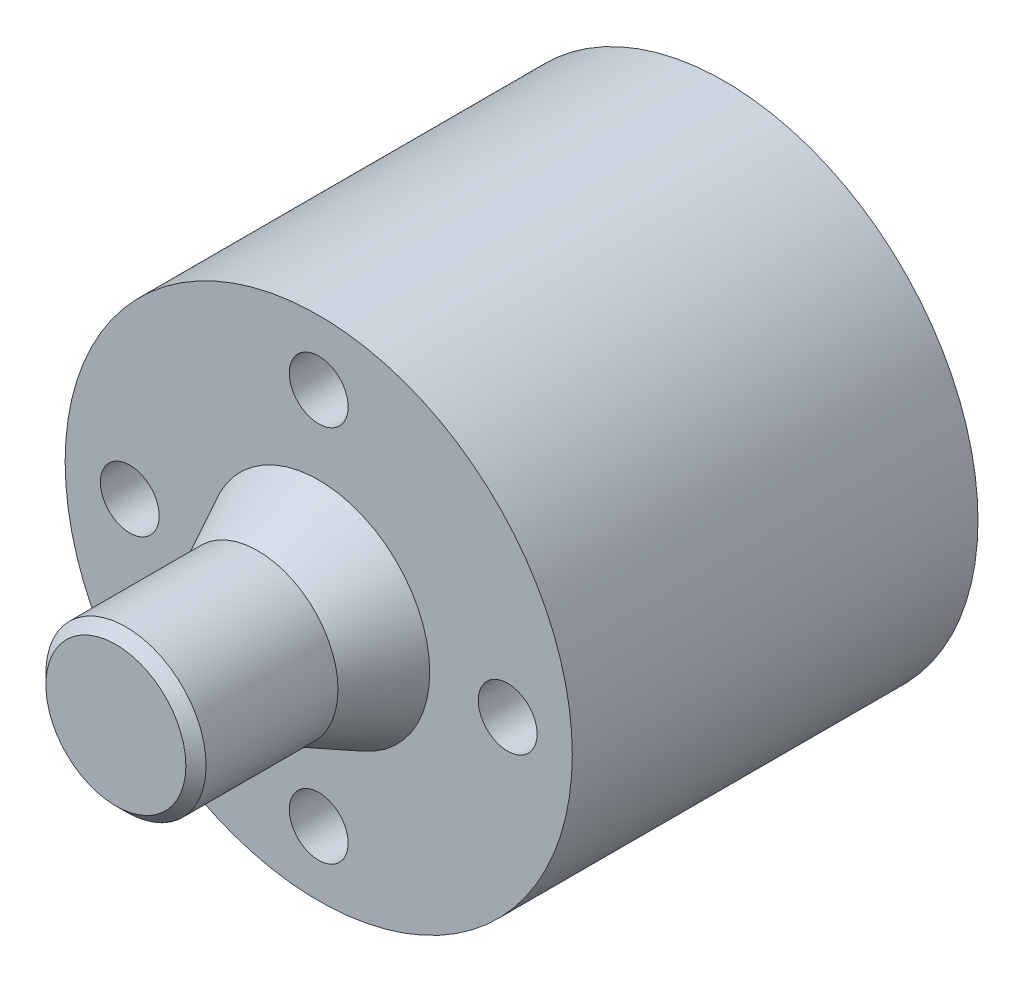
ISO-10303-21;
HEADER;
FILE_DESCRIPTION(('STEP AP214'),'2;1');
FILE_NAME('part.step','',(''),(''),'','','');
FILE_SCHEMA(('AUTOMOTIVE_DESIGN { 1 0 10303 214 1 1 1 1 }'));
ENDSEC;
DATA;
#1=APPLICATION_CONTEXT('core data for automotive mechanical design processes');
#2=APPLICATION_PROTOCOL_DEFINITION('international standard','automotive_design',2000,#1);
#3=PRODUCT_CONTEXT('',#1,'mechanical');
#4=PRODUCT('Part','Part','',(#3));
#5=PRODUCT_RELATED_PRODUCT_CATEGORY('part','',(#4));
#6=PRODUCT_DEFINITION_FORMATION('','',#4);
#7=PRODUCT_DEFINITION_CONTEXT('part definition',#1,'design');
#8=PRODUCT_DEFINITION('design','',#6,#7);
#9=PRODUCT_DEFINITION_SHAPE('','',#8);
#10=(LENGTH_UNIT() NAMED_UNIT(*) SI_UNIT(.MILLI.,.METRE.));
#11=(NAMED_UNIT(*) PLANE_ANGLE_UNIT() SI_UNIT($,.RADIAN.));
#12=(NAMED_UNIT(*) SI_UNIT($,.STERADIAN.) SOLID_ANGLE_UNIT());
#13=UNCERTAINTY_MEASURE_WITH_UNIT(LENGTH_MEASURE(1.E-05),#10,'distance_accuracy_value','');
#14=(GEOMETRIC_REPRESENTATION_CONTEXT(3) GLOBAL_UNCERTAINTY_ASSIGNED_CONTEXT((#13)) GLOBAL_UNIT_ASSIGNED_CONTEXT((#10,
#11,#12)) REPRESENTATION_CONTEXT('',''));
#15=CARTESIAN_POINT('',(0.,0.,0.));
#16=DIRECTION('',(0.,0.,1.));
#17=DIRECTION('',(1.,0.,0.));
#18=AXIS2_PLACEMENT_3D('',#15,#16,#17);
#19=CARTESIAN_POINT('',(0.,0.,7.5));
#20=DIRECTION('',(0.,0.,-1.));
#21=DIRECTION('',(-1.,0.,0.));
#22=AXIS2_PLACEMENT_3D('',#19,#20,#21);
#23=CYLINDRICAL_SURFACE('',#22,12.5);
#24=CARTESIAN_POINT('',(0.,0.,-7.5));
#25=DIRECTION('',(0.,0.,1.));
#26=DIRECTION('',(1.,0.,0.));
#27=AXIS2_PLACEMENT_3D('',#24,#25,#26);
#28=CIRCLE('',#27,12.5);
#29=CARTESIAN_POINT('',(12.5,0.,-7.5));
#30=VERTEX_POINT('',#29);
#31=EDGE_CURVE('E105',#30,#30,#28,.T.);
#32=ORIENTED_EDGE('',*,*,#31,.T.);
#33=EDGE_LOOP('',(#32));
#34=FACE_BOUND('',#33,.T.);
#35=CARTESIAN_POINT('',(0.,0.,12.5));
#36=DIRECTION('',(0.,0.,1.));
#37=DIRECTION('',(1.,0.,0.));
#38=AXIS2_PLACEMENT_3D('',#35,#36,#37);
#39=CIRCLE('',#38,12.5);
#40=CARTESIAN_POINT('',(12.5,0.,12.5));
#41=VERTEX_POINT('',#40);
#42=EDGE_CURVE('E110',#41,#41,#39,.T.);
#43=ORIENTED_EDGE('',*,*,#42,.F.);
#44=EDGE_LOOP('',(#43));
#45=FACE_BOUND('',#44,.T.);
#46=ADVANCED_FACE('F34',(#34,#45),#23,.T.);
#47=CARTESIAN_POINT('',(0.,0.,-7.5));
#48=DIRECTION('',(0.,0.,1.));
#49=DIRECTION('',(1.,0.,0.));
#50=AXIS2_PLACEMENT_3D('',#47,#48,#49);
#51=PLANE('',#50);
#52=CARTESIAN_POINT('',(9.315,0.,-7.5));
#53=DIRECTION('',(0.,0.,1.));
#54=DIRECTION('',(1.,0.,0.));
#55=AXIS2_PLACEMENT_3D('',#52,#53,#54);
#56=CIRCLE('',#55,1.45);
#57=CARTESIAN_POINT('',(10.765,0.,-7.5));
#58=VERTEX_POINT('',#57);
#59=EDGE_CURVE('E191',#58,#58,#56,.T.);
#60=ORIENTED_EDGE('',*,*,#59,.T.);
#61=EDGE_LOOP('',(#60));
#62=FACE_BOUND('',#61,.T.);
#63=CARTESIAN_POINT('',(0.,-9.315,-7.5));
#64=DIRECTION('',(0.,0.,1.));
#65=DIRECTION('',(1.,0.,0.));
#66=AXIS2_PLACEMENT_3D('',#63,#64,#65);
#67=CIRCLE('',#66,1.45);
#68=CARTESIAN_POINT('',(1.44999999999997,-9.315,-7.5));
#69=VERTEX_POINT('',#68);
#70=EDGE_CURVE('E194',#69,#69,#67,.T.);
#71=ORIENTED_EDGE('',*,*,#70,.T.);
#72=EDGE_LOOP('',(#71));
#73=FACE_BOUND('',#72,.T.);
#74=CARTESIAN_POINT('',(-9.315,0.,-7.5));
#75=DIRECTION('',(0.,0.,1.));
#76=DIRECTION('',(1.,0.,0.));
#77=AXIS2_PLACEMENT_3D('',#74,#75,#76);
#78=CIRCLE('',#77,1.45);
#79=CARTESIAN_POINT('',(-7.865,0.,-7.5));
#80=VERTEX_POINT('',#79);
#81=EDGE_CURVE('E197',#80,#80,#78,.T.);
#82=ORIENTED_EDGE('',*,*,#81,.T.);
#83=EDGE_LOOP('',(#82));
#84=FACE_BOUND('',#83,.T.);
#85=CARTESIAN_POINT('',(0.,9.315,-7.5));
#86=DIRECTION('',(0.,0.,1.));
#87=DIRECTION('',(1.,0.,0.));
#88=AXIS2_PLACEMENT_3D('',#85,#86,#87);
#89=CIRCLE('',#88,1.45);
#90=CARTESIAN_POINT('',(1.4500000000001,9.315,-7.5));
#91=VERTEX_POINT('',#90);
#92=EDGE_CURVE('E190',#91,#91,#89,.T.);
#93=ORIENTED_EDGE('',*,*,#92,.T.);
#94=EDGE_LOOP('',(#93));
#95=FACE_BOUND('',#94,.T.);
#96=DIRECTION('',(-1.,0.,0.));
#97=VECTOR('',#96,1.);
#98=CARTESIAN_POINT('',(-6.125,-6.125,-7.5));
#99=LINE('',#98,#97);
#100=CARTESIAN_POINT('',(6.125,-6.125,-7.5));
#101=VERTEX_POINT('',#100);
#102=CARTESIAN_POINT('',(-6.125,-6.125,-7.5));
#103=VERTEX_POINT('',#102);
#104=EDGE_CURVE('E203',#101,#103,#99,.T.);
#105=ORIENTED_EDGE('',*,*,#104,.F.);
#106=DIRECTION('',(0.,-1.,0.));
#107=VECTOR('',#106,1.);
#108=CARTESIAN_POINT('',(6.125,6.125,-7.5));
#109=LINE('',#108,#107);
#110=CARTESIAN_POINT('',(6.125,6.125,-7.5));
#111=VERTEX_POINT('',#110);
#112=EDGE_CURVE('E90',#111,#101,#109,.T.);
#113=ORIENTED_EDGE('',*,*,#112,.F.);
#114=DIRECTION('',(1.,0.,0.));
#115=VECTOR('',#114,1.);
#116=CARTESIAN_POINT('',(-6.125,6.125,-7.5));
#117=LINE('',#116,#115);
#118=CARTESIAN_POINT('',(-6.125,6.125,-7.5));
#119=VERTEX_POINT('',#118);
#120=EDGE_CURVE('E94',#119,#111,#117,.T.);
#121=ORIENTED_EDGE('',*,*,#120,.F.);
#122=DIRECTION('',(0.,1.,0.));
#123=VECTOR('',#122,1.);
#124=CARTESIAN_POINT('',(-6.125,6.125,-7.5));
#125=LINE('',#124,#123);
#126=EDGE_CURVE('E49',#103,#119,#125,.T.);
#127=ORIENTED_EDGE('',*,*,#126,.F.);
#128=EDGE_LOOP('',(#105,#113,#121,#127));
#129=FACE_BOUND('',#128,.T.);
#130=ORIENTED_EDGE('',*,*,#31,.F.);
#131=EDGE_LOOP('',(#130));
#132=FACE_BOUND('',#131,.T.);
#133=ADVANCED_FACE('F126',(#62,#73,#84,#95,#129,#132),#51,.F.);
#134=CARTESIAN_POINT('',(6.125,6.125,-7.501));
#135=DIRECTION('',(1.,0.,0.));
#136=DIRECTION('',(0.,1.,0.));
#137=AXIS2_PLACEMENT_3D('',#134,#135,#136);
#138=PLANE('',#137);
#139=ORIENTED_EDGE('',*,*,#112,.T.);
#140=DIRECTION('',(0.,0.,1.));
#141=VECTOR('',#140,1.);
#142=CARTESIAN_POINT('',(6.125,-6.125,-7.501));
#143=LINE('',#142,#141);
#144=CARTESIAN_POINT('',(6.125,-6.125,7.5));
#145=VERTEX_POINT('',#144);
#146=EDGE_CURVE('E57',#101,#145,#143,.T.);
#147=ORIENTED_EDGE('',*,*,#146,.T.);
#148=DIRECTION('',(0.,1.,0.));
#149=VECTOR('',#148,1.);
#150=CARTESIAN_POINT('',(6.125,6.125,7.5));
#151=LINE('',#150,#149);
#152=CARTESIAN_POINT('',(6.125,6.125,7.5));
#153=VERTEX_POINT('',#152);
#154=EDGE_CURVE('E80',#145,#153,#151,.T.);
#155=ORIENTED_EDGE('',*,*,#154,.T.);
#156=DIRECTION('',(0.,0.,1.));
#157=VECTOR('',#156,1.);
#158=CARTESIAN_POINT('',(6.125,6.125,-7.501));
#159=LINE('',#158,#157);
#160=EDGE_CURVE('E88',#111,#153,#159,.T.);
#161=ORIENTED_EDGE('',*,*,#160,.F.);
#162=EDGE_LOOP('',(#139,#147,#155,#161));
#163=FACE_BOUND('',#162,.T.);
#164=ADVANCED_FACE('F87',(#163),#138,.F.);
#165=CARTESIAN_POINT('',(-6.125,-6.125,-7.501));
#166=DIRECTION('',(0.,-1.,0.));
#167=DIRECTION('',(0.,0.,-1.));
#168=AXIS2_PLACEMENT_3D('',#165,#166,#167);
#169=PLANE('',#168);
#170=ORIENTED_EDGE('',*,*,#104,.T.);
#171=DIRECTION('',(0.,0.,1.));
#172=VECTOR('',#171,1.);
#173=CARTESIAN_POINT('',(-6.125,-6.125,-7.501));
#174=LINE('',#173,#172);
#175=CARTESIAN_POINT('',(-6.125,-6.125,7.5));
#176=VERTEX_POINT('',#175);
#177=EDGE_CURVE('E99',#103,#176,#174,.T.);
#178=ORIENTED_EDGE('',*,*,#177,.T.);
#179=DIRECTION('',(1.,0.,0.));
#180=VECTOR('',#179,1.);
#181=CARTESIAN_POINT('',(-6.125,-6.125,7.5));
#182=LINE('',#181,#180);
#183=EDGE_CURVE('E97',#176,#145,#182,.T.);
#184=ORIENTED_EDGE('',*,*,#183,.T.);
#185=ORIENTED_EDGE('',*,*,#146,.F.);
#186=EDGE_LOOP('',(#170,#178,#184,#185));
#187=FACE_BOUND('',#186,.T.);
#188=ADVANCED_FACE('F137',(#187),#169,.F.);
#189=CARTESIAN_POINT('',(-6.125,6.125,-7.501));
#190=DIRECTION('',(-1.,0.,0.));
#191=DIRECTION('',(0.,-1.,0.));
#192=AXIS2_PLACEMENT_3D('',#189,#190,#191);
#193=PLANE('',#192);
#194=ORIENTED_EDGE('',*,*,#126,.T.);
#195=DIRECTION('',(0.,0.,1.));
#196=VECTOR('',#195,1.);
#197=CARTESIAN_POINT('',(-6.125,6.125,-7.501));
#198=LINE('',#197,#196);
#199=CARTESIAN_POINT('',(-6.125,6.125,7.5));
#200=VERTEX_POINT('',#199);
#201=EDGE_CURVE('E96',#119,#200,#198,.T.);
#202=ORIENTED_EDGE('',*,*,#201,.T.);
#203=DIRECTION('',(0.,-1.,0.));
#204=VECTOR('',#203,1.);
#205=CARTESIAN_POINT('',(-6.125,6.125,7.5));
#206=LINE('',#205,#204);
#207=EDGE_CURVE('E82',#200,#176,#206,.T.);
#208=ORIENTED_EDGE('',*,*,#207,.T.);
#209=ORIENTED_EDGE('',*,*,#177,.F.);
#210=EDGE_LOOP('',(#194,#202,#208,#209));
#211=FACE_BOUND('',#210,.T.);
#212=ADVANCED_FACE('F141',(#211),#193,.F.);
#213=CARTESIAN_POINT('',(-6.125,6.125,-7.501));
#214=DIRECTION('',(0.,1.,0.));
#215=DIRECTION('',(0.,0.,1.));
#216=AXIS2_PLACEMENT_3D('',#213,#214,#215);
#217=PLANE('',#216);
#218=ORIENTED_EDGE('',*,*,#120,.T.);
#219=ORIENTED_EDGE('',*,*,#160,.T.);
#220=DIRECTION('',(-1.,0.,0.));
#221=VECTOR('',#220,1.);
#222=CARTESIAN_POINT('',(-6.125,6.125,7.5));
#223=LINE('',#222,#221);
#224=EDGE_CURVE('E77',#153,#200,#223,.T.);
#225=ORIENTED_EDGE('',*,*,#224,.T.);
#226=ORIENTED_EDGE('',*,*,#201,.F.);
#227=EDGE_LOOP('',(#218,#219,#225,#226));
#228=FACE_BOUND('',#227,.T.);
#229=ADVANCED_FACE('F92',(#228),#217,.F.);
#230=CARTESIAN_POINT('',(0.,9.315,-7.5));
#231=DIRECTION('',(0.,0.,1.));
#232=DIRECTION('',(1.,0.,0.));
#233=AXIS2_PLACEMENT_3D('',#230,#231,#232);
#234=CYLINDRICAL_SURFACE('',#233,1.45);
#235=ORIENTED_EDGE('',*,*,#92,.F.);
#236=EDGE_LOOP('',(#235));
#237=FACE_BOUND('',#236,.T.);
#238=CARTESIAN_POINT('',(0.,9.315,12.5));
#239=DIRECTION('',(0.,0.,1.));
#240=DIRECTION('',(1.,0.,0.));
#241=AXIS2_PLACEMENT_3D('',#238,#239,#240);
#242=CIRCLE('',#241,1.45);
#243=CARTESIAN_POINT('',(1.4500000000001,9.315,12.5));
#244=VERTEX_POINT('',#243);
#245=EDGE_CURVE('E186',#244,#244,#242,.T.);
#246=ORIENTED_EDGE('',*,*,#245,.T.);
#247=EDGE_LOOP('',(#246));
#248=FACE_BOUND('',#247,.T.);
#249=ADVANCED_FACE('F140',(#237,#248),#234,.F.);
#250=CARTESIAN_POINT('',(-9.315,0.,-7.5));
#251=DIRECTION('',(0.,0.,1.));
#252=DIRECTION('',(1.,0.,0.));
#253=AXIS2_PLACEMENT_3D('',#250,#251,#252);
#254=CYLINDRICAL_SURFACE('',#253,1.45);
#255=ORIENTED_EDGE('',*,*,#81,.F.);
#256=EDGE_LOOP('',(#255));
#257=FACE_BOUND('',#256,.T.);
#258=CARTESIAN_POINT('',(-9.315,0.,12.5));
#259=DIRECTION('',(0.,0.,1.));
#260=DIRECTION('',(1.,0.,0.));
#261=AXIS2_PLACEMENT_3D('',#258,#259,#260);
#262=CIRCLE('',#261,1.45);
#263=CARTESIAN_POINT('',(-7.865,0.,12.5));
#264=VERTEX_POINT('',#263);
#265=EDGE_CURVE('E179',#264,#264,#262,.T.);
#266=ORIENTED_EDGE('',*,*,#265,.T.);
#267=EDGE_LOOP('',(#266));
#268=FACE_BOUND('',#267,.T.);
#269=ADVANCED_FACE('F148',(#257,#268),#254,.F.);
#270=CARTESIAN_POINT('',(0.,-9.315,-7.5));
#271=DIRECTION('',(0.,0.,1.));
#272=DIRECTION('',(1.,0.,0.));
#273=AXIS2_PLACEMENT_3D('',#270,#271,#272);
#274=CYLINDRICAL_SURFACE('',#273,1.45);
#275=ORIENTED_EDGE('',*,*,#70,.F.);
#276=EDGE_LOOP('',(#275));
#277=FACE_BOUND('',#276,.T.);
#278=CARTESIAN_POINT('',(0.,-9.315,12.5));
#279=DIRECTION('',(0.,0.,1.));
#280=DIRECTION('',(1.,0.,0.));
#281=AXIS2_PLACEMENT_3D('',#278,#279,#280);
#282=CIRCLE('',#281,1.45);
#283=CARTESIAN_POINT('',(1.44999999999997,-9.315,12.5));
#284=VERTEX_POINT('',#283);
#285=EDGE_CURVE('E182',#284,#284,#282,.T.);
#286=ORIENTED_EDGE('',*,*,#285,.T.);
#287=EDGE_LOOP('',(#286));
#288=FACE_BOUND('',#287,.T.);
#289=ADVANCED_FACE('F152',(#277,#288),#274,.F.);
#290=CARTESIAN_POINT('',(9.315,0.,-7.5));
#291=DIRECTION('',(0.,0.,1.));
#292=DIRECTION('',(1.,0.,0.));
#293=AXIS2_PLACEMENT_3D('',#290,#291,#292);
#294=CYLINDRICAL_SURFACE('',#293,1.45);
#295=ORIENTED_EDGE('',*,*,#59,.F.);
#296=EDGE_LOOP('',(#295));
#297=FACE_BOUND('',#296,.T.);
#298=CARTESIAN_POINT('',(9.315,0.,12.5));
#299=DIRECTION('',(0.,0.,1.));
#300=DIRECTION('',(1.,0.,0.));
#301=AXIS2_PLACEMENT_3D('',#298,#299,#300);
#302=CIRCLE('',#301,1.45);
#303=CARTESIAN_POINT('',(10.765,0.,12.5));
#304=VERTEX_POINT('',#303);
#305=EDGE_CURVE('E218',#304,#304,#302,.T.);
#306=ORIENTED_EDGE('',*,*,#305,.T.);
#307=EDGE_LOOP('',(#306));
#308=FACE_BOUND('',#307,.T.);
#309=ADVANCED_FACE('F156',(#297,#308),#294,.F.);
#310=CARTESIAN_POINT('',(0.,0.,7.5));
#311=DIRECTION('',(0.,0.,1.));
#312=DIRECTION('',(1.,0.,0.));
#313=AXIS2_PLACEMENT_3D('',#310,#311,#312);
#314=PLANE('',#313);
#315=ORIENTED_EDGE('',*,*,#154,.F.);
#316=ORIENTED_EDGE('',*,*,#183,.F.);
#317=ORIENTED_EDGE('',*,*,#207,.F.);
#318=ORIENTED_EDGE('',*,*,#224,.F.);
#319=EDGE_LOOP('',(#315,#316,#317,#318));
#320=FACE_BOUND('',#319,.T.);
#321=ADVANCED_FACE('F79',(#320),#314,.F.);
#322=CARTESIAN_POINT('',(0.,0.,12.5));
#323=DIRECTION('',(0.,0.,1.));
#324=DIRECTION('',(1.,0.,0.));
#325=AXIS2_PLACEMENT_3D('',#322,#323,#324);
#326=PLANE('',#325);
#327=ORIENTED_EDGE('',*,*,#265,.F.);
#328=EDGE_LOOP('',(#327));
#329=FACE_BOUND('',#328,.T.);
#330=ORIENTED_EDGE('',*,*,#285,.F.);
#331=EDGE_LOOP('',(#330));
#332=FACE_BOUND('',#331,.T.);
#333=ORIENTED_EDGE('',*,*,#305,.F.);
#334=EDGE_LOOP('',(#333));
#335=FACE_BOUND('',#334,.T.);
#336=ORIENTED_EDGE('',*,*,#245,.F.);
#337=EDGE_LOOP('',(#336));
#338=FACE_BOUND('',#337,.T.);
#339=CARTESIAN_POINT('',(0.,0.,12.5));
#340=DIRECTION('',(0.,0.,1.));
#341=DIRECTION('',(1.,0.,0.));
#342=AXIS2_PLACEMENT_3D('',#339,#340,#341);
#343=CIRCLE('',#342,5.47289320511985);
#344=CARTESIAN_POINT('',(5.47289320511985,0.,12.5));
#345=VERTEX_POINT('',#344);
#346=EDGE_CURVE('E108',#345,#345,#343,.F.);
#347=ORIENTED_EDGE('',*,*,#346,.T.);
#348=EDGE_LOOP('',(#347));
#349=FACE_BOUND('',#348,.T.);
#350=ORIENTED_EDGE('',*,*,#42,.T.);
#351=EDGE_LOOP('',(#350));
#352=FACE_BOUND('',#351,.T.);
#353=ADVANCED_FACE('F163',(#329,#332,#335,#338,#349,#352),#326,.T.);
#354=CARTESIAN_POINT('',(0.,0.,15.5));
#355=DIRECTION('',(0.,0.,-1.));
#356=DIRECTION('',(-1.,0.,0.));
#357=AXIS2_PLACEMENT_3D('',#354,#355,#356);
#358=CONICAL_SURFACE('',#357,3.95,0.469733810632562);
#359=ORIENTED_EDGE('',*,*,#346,.F.);
#360=EDGE_LOOP('',(#359));
#361=FACE_BOUND('',#360,.T.);
#362=CARTESIAN_POINT('',(0.,0.,15.5));
#363=DIRECTION('',(0.,0.,1.));
#364=DIRECTION('',(1.,0.,0.));
#365=AXIS2_PLACEMENT_3D('',#362,#363,#364);
#366=CIRCLE('',#365,3.95);
#367=CARTESIAN_POINT('',(3.95,0.,15.5));
#368=VERTEX_POINT('',#367);
#369=EDGE_CURVE('E111',#368,#368,#366,.T.);
#370=ORIENTED_EDGE('',*,*,#369,.F.);
#371=EDGE_LOOP('',(#370));
#372=FACE_BOUND('',#371,.T.);
#373=ADVANCED_FACE('F166',(#361,#372),#358,.T.);
#374=CARTESIAN_POINT('',(0.,0.,22.5));
#375=DIRECTION('',(0.,0.,-1.));
#376=DIRECTION('',(-1.,0.,0.));
#377=AXIS2_PLACEMENT_3D('',#374,#375,#376);
#378=CYLINDRICAL_SURFACE('',#377,3.95);
#379=CARTESIAN_POINT('',(0.,0.,22.));
#380=DIRECTION('',(0.,0.,1.));
#381=DIRECTION('',(1.,0.,0.));
#382=AXIS2_PLACEMENT_3D('',#379,#380,#381);
#383=CIRCLE('',#382,3.95);
#384=CARTESIAN_POINT('',(3.95,0.,22.));
#385=VERTEX_POINT('',#384);
#386=EDGE_CURVE('E11',#385,#385,#383,.F.);
#387=ORIENTED_EDGE('',*,*,#386,.T.);
#388=EDGE_LOOP('',(#387));
#389=FACE_BOUND('',#388,.T.);
#390=ORIENTED_EDGE('',*,*,#369,.T.);
#391=EDGE_LOOP('',(#390));
#392=FACE_BOUND('',#391,.T.);
#393=ADVANCED_FACE('F122',(#389,#392),#378,.T.);
#394=CARTESIAN_POINT('',(0.,0.,22.5));
#395=DIRECTION('',(0.,0.,1.));
#396=DIRECTION('',(1.,0.,0.));
#397=AXIS2_PLACEMENT_3D('',#394,#395,#396);
#398=PLANE('',#397);
#399=CARTESIAN_POINT('',(0.,0.,22.5));
#400=DIRECTION('',(0.,0.,1.));
#401=DIRECTION('',(1.,0.,0.));
#402=AXIS2_PLACEMENT_3D('',#399,#400,#401);
#403=CIRCLE('',#402,3.45);
#404=CARTESIAN_POINT('',(3.45,0.,22.5));
#405=VERTEX_POINT('',#404);
#406=EDGE_CURVE('E42',#405,#405,#403,.T.);
#407=ORIENTED_EDGE('',*,*,#406,.T.);
#408=EDGE_LOOP('',(#407));
#409=FACE_BOUND('',#408,.T.);
#410=ADVANCED_FACE('F115',(#409),#398,.T.);
#411=CARTESIAN_POINT('',(0.,0.,22.5));
#412=DIRECTION('',(0.,0.,-1.));
#413=DIRECTION('',(-1.,0.,0.));
#414=AXIS2_PLACEMENT_3D('',#411,#412,#413);
#415=CONICAL_SURFACE('',#414,3.45,0.785398163397447);
#416=ORIENTED_EDGE('',*,*,#386,.F.);
#417=EDGE_LOOP('',(#416));
#418=FACE_BOUND('',#417,.T.);
#419=ORIENTED_EDGE('',*,*,#406,.F.);
#420=EDGE_LOOP('',(#419));
#421=FACE_BOUND('',#420,.T.);
#422=ADVANCED_FACE('F36',(#418,#421),#415,.T.);
#423=CLOSED_SHELL('',(#46,#133,#164,#188,#212,#229,#249,#269,#289,#309,#321,#353,#373,#393,#410,#422));
#424=MANIFOLD_SOLID_BREP('B2',#423);
#425=ADVANCED_BREP_SHAPE_REPRESENTATION('',(#18,#424),#14);
#426=SHAPE_DEFINITION_REPRESENTATION(#9,#425);
ENDSEC;
END-ISO-10303-21;
